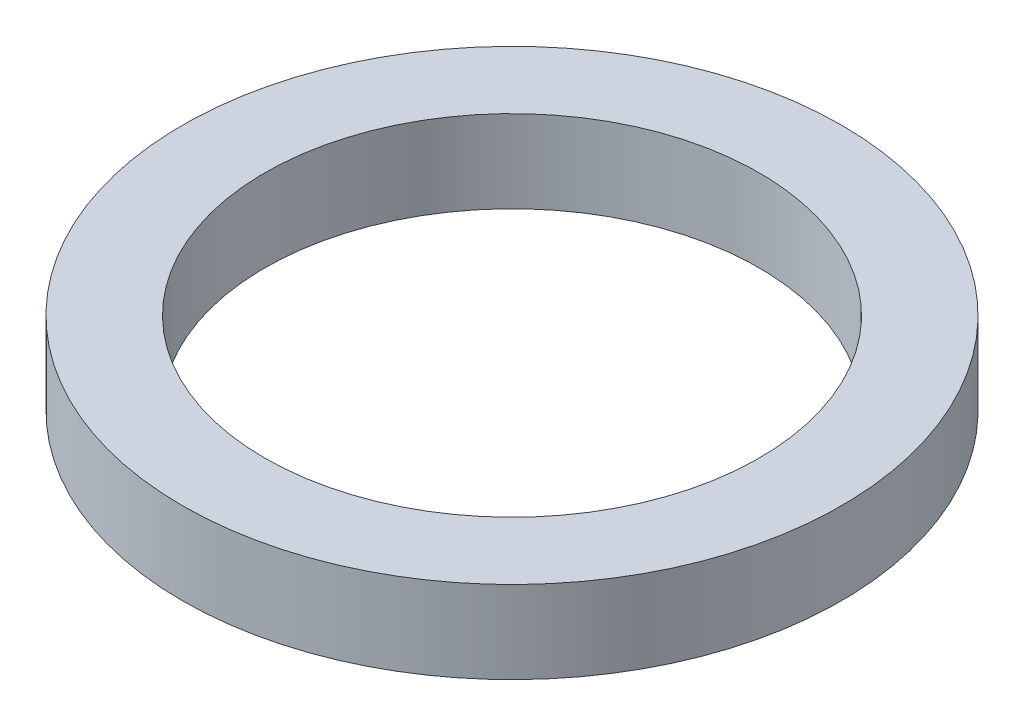
ISO-10303-21;
HEADER;
FILE_DESCRIPTION(('STEP AP214'),'2;1');
FILE_NAME('part.step','',(''),(''),'','','');
FILE_SCHEMA(('AUTOMOTIVE_DESIGN { 1 0 10303 214 1 1 1 1 }'));
ENDSEC;
DATA;
#1=APPLICATION_CONTEXT('core data for automotive mechanical design processes');
#2=APPLICATION_PROTOCOL_DEFINITION('international standard','automotive_design',2000,#1);
#3=PRODUCT_CONTEXT('',#1,'mechanical');
#4=PRODUCT('Part','Part','',(#3));
#5=PRODUCT_RELATED_PRODUCT_CATEGORY('part','',(#4));
#6=PRODUCT_DEFINITION_FORMATION('','',#4);
#7=PRODUCT_DEFINITION_CONTEXT('part definition',#1,'design');
#8=PRODUCT_DEFINITION('design','',#6,#7);
#9=PRODUCT_DEFINITION_SHAPE('','',#8);
#10=(LENGTH_UNIT() NAMED_UNIT(*) SI_UNIT(.MILLI.,.METRE.));
#11=(NAMED_UNIT(*) PLANE_ANGLE_UNIT() SI_UNIT($,.RADIAN.));
#12=(NAMED_UNIT(*) SI_UNIT($,.STERADIAN.) SOLID_ANGLE_UNIT());
#13=UNCERTAINTY_MEASURE_WITH_UNIT(LENGTH_MEASURE(1.E-05),#10,'distance_accuracy_value','');
#14=(GEOMETRIC_REPRESENTATION_CONTEXT(3) GLOBAL_UNCERTAINTY_ASSIGNED_CONTEXT((#13)) GLOBAL_UNIT_ASSIGNED_CONTEXT((#10,
#11,#12)) REPRESENTATION_CONTEXT('',''));
#15=CARTESIAN_POINT('',(0.,0.,0.));
#16=DIRECTION('',(0.,0.,1.));
#17=DIRECTION('',(1.,0.,0.));
#18=AXIS2_PLACEMENT_3D('',#15,#16,#17);
#19=CARTESIAN_POINT('',(0.,1.,0.));
#20=DIRECTION('',(0.,1.,0.));
#21=DIRECTION('',(0.,0.,1.));
#22=AXIS2_PLACEMENT_3D('',#19,#20,#21);
#23=PLANE('',#22);
#24=CARTESIAN_POINT('',(0.,1.,0.));
#25=DIRECTION('',(0.,1.,0.));
#26=DIRECTION('',(0.,0.,1.));
#27=AXIS2_PLACEMENT_3D('',#24,#25,#26);
#28=CIRCLE('',#27,4.);
#29=CARTESIAN_POINT('',(0.,1.,4.));
#30=VERTEX_POINT('',#29);
#31=EDGE_CURVE('E10',#30,#30,#28,.T.);
#32=ORIENTED_EDGE('',*,*,#31,.T.);
#33=EDGE_LOOP('',(#32));
#34=FACE_BOUND('',#33,.T.);
#35=CARTESIAN_POINT('',(0.,1.,0.));
#36=DIRECTION('',(0.,1.,0.));
#37=DIRECTION('',(0.,0.,1.));
#38=AXIS2_PLACEMENT_3D('',#35,#36,#37);
#39=CIRCLE('',#38,3.);
#40=CARTESIAN_POINT('',(0.,1.,3.));
#41=VERTEX_POINT('',#40);
#42=EDGE_CURVE('E58',#41,#41,#39,.T.);
#43=ORIENTED_EDGE('',*,*,#42,.F.);
#44=EDGE_LOOP('',(#43));
#45=FACE_BOUND('',#44,.T.);
#46=ADVANCED_FACE('F47',(#34,#45),#23,.T.);
#47=CARTESIAN_POINT('',(0.,0.,0.));
#48=DIRECTION('',(0.,1.,0.));
#49=DIRECTION('',(0.,0.,1.));
#50=AXIS2_PLACEMENT_3D('',#47,#48,#49);
#51=PLANE('',#50);
#52=CARTESIAN_POINT('',(0.,0.,0.));
#53=DIRECTION('',(0.,1.,0.));
#54=DIRECTION('',(0.,0.,1.));
#55=AXIS2_PLACEMENT_3D('',#52,#53,#54);
#56=CIRCLE('',#55,4.);
#57=CARTESIAN_POINT('',(0.,0.,4.));
#58=VERTEX_POINT('',#57);
#59=EDGE_CURVE('E51',#58,#58,#56,.T.);
#60=ORIENTED_EDGE('',*,*,#59,.F.);
#61=EDGE_LOOP('',(#60));
#62=FACE_BOUND('',#61,.T.);
#63=CARTESIAN_POINT('',(0.,0.,0.));
#64=DIRECTION('',(0.,1.,0.));
#65=DIRECTION('',(0.,0.,1.));
#66=AXIS2_PLACEMENT_3D('',#63,#64,#65);
#67=CIRCLE('',#66,3.);
#68=CARTESIAN_POINT('',(0.,0.,3.));
#69=VERTEX_POINT('',#68);
#70=EDGE_CURVE('E60',#69,#69,#67,.T.);
#71=ORIENTED_EDGE('',*,*,#70,.T.);
#72=EDGE_LOOP('',(#71));
#73=FACE_BOUND('',#72,.T.);
#74=ADVANCED_FACE('F70',(#62,#73),#51,.F.);
#75=CARTESIAN_POINT('',(0.,1.,0.));
#76=DIRECTION('',(0.,-1.,0.));
#77=DIRECTION('',(0.,0.,-1.));
#78=AXIS2_PLACEMENT_3D('',#75,#76,#77);
#79=CYLINDRICAL_SURFACE('',#78,4.);
#80=ORIENTED_EDGE('',*,*,#31,.F.);
#81=EDGE_LOOP('',(#80));
#82=FACE_BOUND('',#81,.T.);
#83=ORIENTED_EDGE('',*,*,#59,.T.);
#84=EDGE_LOOP('',(#83));
#85=FACE_BOUND('',#84,.T.);
#86=ADVANCED_FACE('F49',(#82,#85),#79,.T.);
#87=CARTESIAN_POINT('',(0.,1.,0.));
#88=DIRECTION('',(0.,-1.,0.));
#89=DIRECTION('',(0.,0.,-1.));
#90=AXIS2_PLACEMENT_3D('',#87,#88,#89);
#91=CYLINDRICAL_SURFACE('',#90,3.);
#92=ORIENTED_EDGE('',*,*,#42,.T.);
#93=EDGE_LOOP('',(#92));
#94=FACE_BOUND('',#93,.T.);
#95=ORIENTED_EDGE('',*,*,#70,.F.);
#96=EDGE_LOOP('',(#95));
#97=FACE_BOUND('',#96,.T.);
#98=ADVANCED_FACE('F66',(#94,#97),#91,.F.);
#99=CLOSED_SHELL('',(#46,#74,#86,#98));
#100=MANIFOLD_SOLID_BREP('B2',#99);
#101=ADVANCED_BREP_SHAPE_REPRESENTATION('',(#18,#100),#14);
#102=SHAPE_DEFINITION_REPRESENTATION(#9,#101);
ENDSEC;
END-ISO-10303-21;
